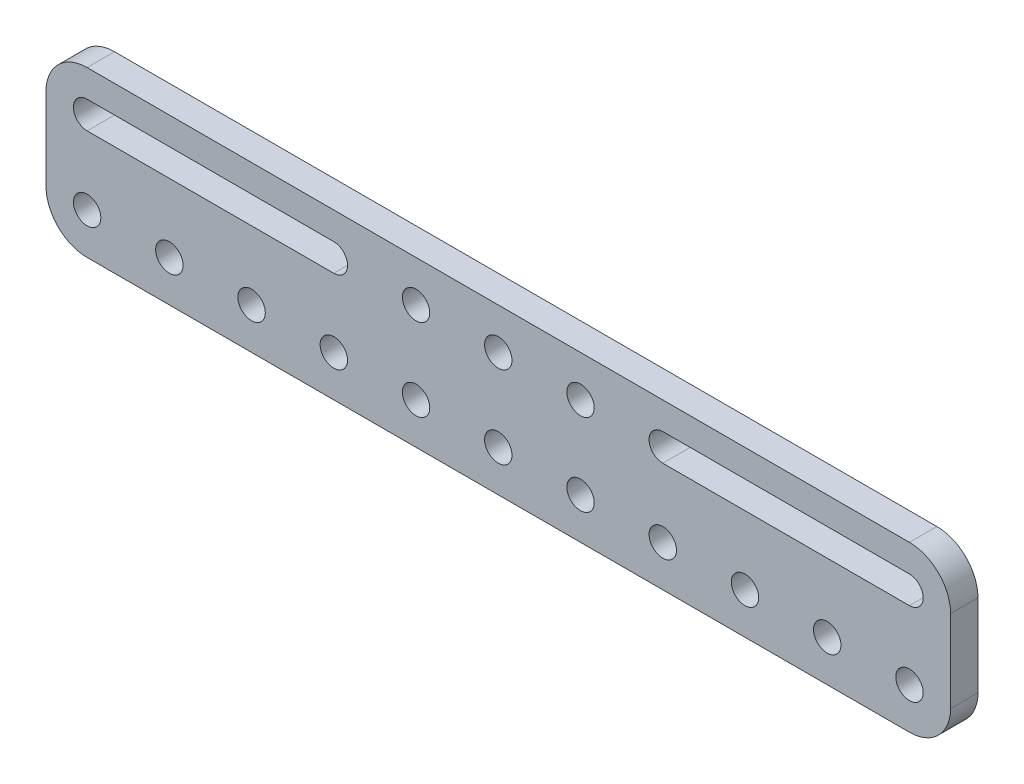
ISO-10303-21;
HEADER;
FILE_DESCRIPTION(('STEP AP214'),'2;1');
FILE_NAME('part.step','',(''),(''),'','','');
FILE_SCHEMA(('AUTOMOTIVE_DESIGN { 1 0 10303 214 1 1 1 1 }'));
ENDSEC;
DATA;
#1=APPLICATION_CONTEXT('core data for automotive mechanical design processes');
#2=APPLICATION_PROTOCOL_DEFINITION('international standard','automotive_design',2000,#1);
#3=PRODUCT_CONTEXT('',#1,'mechanical');
#4=PRODUCT('Part','Part','',(#3));
#5=PRODUCT_RELATED_PRODUCT_CATEGORY('part','',(#4));
#6=PRODUCT_DEFINITION_FORMATION('','',#4);
#7=PRODUCT_DEFINITION_CONTEXT('part definition',#1,'design');
#8=PRODUCT_DEFINITION('design','',#6,#7);
#9=PRODUCT_DEFINITION_SHAPE('','',#8);
#10=(LENGTH_UNIT() NAMED_UNIT(*) SI_UNIT(.MILLI.,.METRE.));
#11=(NAMED_UNIT(*) PLANE_ANGLE_UNIT() SI_UNIT($,.RADIAN.));
#12=(NAMED_UNIT(*) SI_UNIT($,.STERADIAN.) SOLID_ANGLE_UNIT());
#13=UNCERTAINTY_MEASURE_WITH_UNIT(LENGTH_MEASURE(1.E-05),#10,'distance_accuracy_value','');
#14=(GEOMETRIC_REPRESENTATION_CONTEXT(3) GLOBAL_UNCERTAINTY_ASSIGNED_CONTEXT((#13)) GLOBAL_UNIT_ASSIGNED_CONTEXT((#10,
#11,#12)) REPRESENTATION_CONTEXT('',''));
#15=CARTESIAN_POINT('',(0.,0.,0.));
#16=DIRECTION('',(0.,0.,1.));
#17=DIRECTION('',(1.,0.,0.));
#18=AXIS2_PLACEMENT_3D('',#15,#16,#17);
#19=CARTESIAN_POINT('',(346.4291313108,224.2422436139,3.));
#20=DIRECTION('',(0.,0.,1.));
#21=DIRECTION('',(1.,0.,0.));
#22=AXIS2_PLACEMENT_3D('',#19,#20,#21);
#23=PLANE('',#22);
#24=DIRECTION('',(1.,0.,0.));
#25=VECTOR('',#24,1.);
#26=CARTESIAN_POINT('',(256.4291313108,222.7422436139,3.));
#27=LINE('',#26,#25);
#28=CARTESIAN_POINT('',(256.4291313108,222.7422436139,3.));
#29=VERTEX_POINT('',#28);
#30=CARTESIAN_POINT('',(283.4291313108,222.7422436139,3.));
#31=VERTEX_POINT('',#30);
#32=EDGE_CURVE('E184',#29,#31,#27,.T.);
#33=ORIENTED_EDGE('',*,*,#32,.F.);
#34=CARTESIAN_POINT('',(256.4291313108,224.2422436139,3.));
#35=DIRECTION('',(0.,0.,1.));
#36=DIRECTION('',(1.,0.,0.));
#37=AXIS2_PLACEMENT_3D('',#34,#35,#36);
#38=CIRCLE('',#37,1.5);
#39=CARTESIAN_POINT('',(256.4291313108,225.7422436139,3.));
#40=VERTEX_POINT('',#39);
#41=EDGE_CURVE('E182',#40,#29,#38,.T.);
#42=ORIENTED_EDGE('',*,*,#41,.F.);
#43=DIRECTION('',(-1.,0.,0.));
#44=VECTOR('',#43,1.);
#45=CARTESIAN_POINT('',(256.4291313108,225.7422436139,3.));
#46=LINE('',#45,#44);
#47=CARTESIAN_POINT('',(283.4291313108,225.7422436139,3.));
#48=VERTEX_POINT('',#47);
#49=EDGE_CURVE('E190',#48,#40,#46,.T.);
#50=ORIENTED_EDGE('',*,*,#49,.F.);
#51=CARTESIAN_POINT('',(283.4291313108,224.2422436139,3.));
#52=DIRECTION('',(0.,0.,1.));
#53=DIRECTION('',(1.,0.,0.));
#54=AXIS2_PLACEMENT_3D('',#51,#52,#53);
#55=CIRCLE('',#54,1.5);
#56=EDGE_CURVE('E187',#31,#48,#55,.T.);
#57=ORIENTED_EDGE('',*,*,#56,.F.);
#58=EDGE_LOOP('',(#33,#42,#50,#57));
#59=FACE_BOUND('',#58,.T.);
#60=CARTESIAN_POINT('',(256.4291313108,215.2422436139,3.));
#61=DIRECTION('',(0.,0.,1.));
#62=DIRECTION('',(1.,0.,0.));
#63=AXIS2_PLACEMENT_3D('',#60,#61,#62);
#64=CIRCLE('',#63,1.49999999999983);
#65=CARTESIAN_POINT('',(257.9291313108,215.2422436139,3.));
#66=VERTEX_POINT('',#65);
#67=EDGE_CURVE('E219',#66,#66,#64,.T.);
#68=ORIENTED_EDGE('',*,*,#67,.F.);
#69=EDGE_LOOP('',(#68));
#70=FACE_BOUND('',#69,.T.);
#71=CARTESIAN_POINT('',(283.4291313108,215.2422436139,3.));
#72=DIRECTION('',(0.,0.,1.));
#73=DIRECTION('',(1.,0.,0.));
#74=AXIS2_PLACEMENT_3D('',#71,#72,#73);
#75=CIRCLE('',#74,1.5);
#76=CARTESIAN_POINT('',(284.9291313108,215.2422436139,3.));
#77=VERTEX_POINT('',#76);
#78=EDGE_CURVE('E231',#77,#77,#75,.T.);
#79=ORIENTED_EDGE('',*,*,#78,.F.);
#80=EDGE_LOOP('',(#79));
#81=FACE_BOUND('',#80,.T.);
#82=CARTESIAN_POINT('',(301.4291313108,215.2422436139,3.));
#83=DIRECTION('',(0.,0.,1.));
#84=DIRECTION('',(1.,0.,0.));
#85=AXIS2_PLACEMENT_3D('',#82,#83,#84);
#86=CIRCLE('',#85,1.5);
#87=CARTESIAN_POINT('',(302.9291313108,215.2422436139,3.));
#88=VERTEX_POINT('',#87);
#89=EDGE_CURVE('E243',#88,#88,#86,.T.);
#90=ORIENTED_EDGE('',*,*,#89,.F.);
#91=EDGE_LOOP('',(#90));
#92=FACE_BOUND('',#91,.T.);
#93=CARTESIAN_POINT('',(310.4291313108,215.2422436139,3.));
#94=DIRECTION('',(0.,0.,1.));
#95=DIRECTION('',(1.,0.,0.));
#96=AXIS2_PLACEMENT_3D('',#93,#94,#95);
#97=CIRCLE('',#96,1.5);
#98=CARTESIAN_POINT('',(311.9291313108,215.2422436139,3.));
#99=VERTEX_POINT('',#98);
#100=EDGE_CURVE('E255',#99,#99,#97,.T.);
#101=ORIENTED_EDGE('',*,*,#100,.F.);
#102=EDGE_LOOP('',(#101));
#103=FACE_BOUND('',#102,.T.);
#104=CARTESIAN_POINT('',(319.4291313108,215.2422436139,3.));
#105=DIRECTION('',(0.,0.,1.));
#106=DIRECTION('',(1.,0.,0.));
#107=AXIS2_PLACEMENT_3D('',#104,#105,#106);
#108=CIRCLE('',#107,1.5);
#109=CARTESIAN_POINT('',(320.9291313108,215.2422436139,3.));
#110=VERTEX_POINT('',#109);
#111=EDGE_CURVE('E267',#110,#110,#108,.T.);
#112=ORIENTED_EDGE('',*,*,#111,.F.);
#113=EDGE_LOOP('',(#112));
#114=FACE_BOUND('',#113,.T.);
#115=CARTESIAN_POINT('',(301.4291313108,224.2422436139,3.));
#116=DIRECTION('',(0.,0.,1.));
#117=DIRECTION('',(1.,0.,0.));
#118=AXIS2_PLACEMENT_3D('',#115,#116,#117);
#119=CIRCLE('',#118,1.5);
#120=CARTESIAN_POINT('',(302.9291313108,224.2422436139,3.));
#121=VERTEX_POINT('',#120);
#122=EDGE_CURVE('E279',#121,#121,#119,.T.);
#123=ORIENTED_EDGE('',*,*,#122,.F.);
#124=EDGE_LOOP('',(#123));
#125=FACE_BOUND('',#124,.T.);
#126=CARTESIAN_POINT('',(310.4291313108,224.2422436139,3.));
#127=DIRECTION('',(0.,0.,1.));
#128=DIRECTION('',(1.,0.,0.));
#129=AXIS2_PLACEMENT_3D('',#126,#127,#128);
#130=CIRCLE('',#129,1.5);
#131=CARTESIAN_POINT('',(311.9291313108,224.2422436139,3.));
#132=VERTEX_POINT('',#131);
#133=EDGE_CURVE('E291',#132,#132,#130,.T.);
#134=ORIENTED_EDGE('',*,*,#133,.F.);
#135=EDGE_LOOP('',(#134));
#136=FACE_BOUND('',#135,.T.);
#137=CARTESIAN_POINT('',(346.4291313108,224.2422436139,3.));
#138=DIRECTION('',(0.,0.,1.));
#139=DIRECTION('',(1.,0.,0.));
#140=AXIS2_PLACEMENT_3D('',#137,#138,#139);
#141=CIRCLE('',#140,4.5);
#142=CARTESIAN_POINT('',(350.9291313108,224.2422436139,3.));
#143=VERTEX_POINT('',#142);
#144=CARTESIAN_POINT('',(346.4291313108,228.7422436139,3.));
#145=VERTEX_POINT('',#144);
#146=EDGE_CURVE('E297',#143,#145,#141,.T.);
#147=ORIENTED_EDGE('',*,*,#146,.T.);
#148=DIRECTION('',(-1.,0.,0.));
#149=VECTOR('',#148,1.);
#150=CARTESIAN_POINT('',(256.4291313108,228.7422436139,3.));
#151=LINE('',#150,#149);
#152=CARTESIAN_POINT('',(256.4291313108,228.7422436139,3.));
#153=VERTEX_POINT('',#152);
#154=EDGE_CURVE('E300',#145,#153,#151,.T.);
#155=ORIENTED_EDGE('',*,*,#154,.T.);
#156=CARTESIAN_POINT('',(256.4291313108,224.2422436139,3.));
#157=DIRECTION('',(0.,0.,1.));
#158=DIRECTION('',(1.,0.,0.));
#159=AXIS2_PLACEMENT_3D('',#156,#157,#158);
#160=CIRCLE('',#159,4.5);
#161=CARTESIAN_POINT('',(251.9291313108,224.2422436139,3.));
#162=VERTEX_POINT('',#161);
#163=EDGE_CURVE('E303',#153,#162,#160,.T.);
#164=ORIENTED_EDGE('',*,*,#163,.T.);
#165=DIRECTION('',(0.,-1.,0.));
#166=VECTOR('',#165,1.);
#167=CARTESIAN_POINT('',(251.9291313108,224.2422436139,3.));
#168=LINE('',#167,#166);
#169=CARTESIAN_POINT('',(251.9291313108,215.2422436139,3.));
#170=VERTEX_POINT('',#169);
#171=EDGE_CURVE('E305',#162,#170,#168,.T.);
#172=ORIENTED_EDGE('',*,*,#171,.T.);
#173=CARTESIAN_POINT('',(256.4291313108,215.2422436139,3.));
#174=DIRECTION('',(0.,0.,1.));
#175=DIRECTION('',(1.,0.,0.));
#176=AXIS2_PLACEMENT_3D('',#173,#174,#175);
#177=CIRCLE('',#176,4.50000000000023);
#178=CARTESIAN_POINT('',(256.4291313108,210.7422436139,3.));
#179=VERTEX_POINT('',#178);
#180=EDGE_CURVE('E307',#170,#179,#177,.T.);
#181=ORIENTED_EDGE('',*,*,#180,.T.);
#182=DIRECTION('',(1.,0.,0.));
#183=VECTOR('',#182,1.);
#184=CARTESIAN_POINT('',(346.4291313108,210.7422436139,3.));
#185=LINE('',#184,#183);
#186=CARTESIAN_POINT('',(346.4291313108,210.7422436139,3.));
#187=VERTEX_POINT('',#186);
#188=EDGE_CURVE('E309',#179,#187,#185,.T.);
#189=ORIENTED_EDGE('',*,*,#188,.T.);
#190=CARTESIAN_POINT('',(346.4291313108,215.2422436139,3.));
#191=DIRECTION('',(0.,0.,1.));
#192=DIRECTION('',(1.,0.,0.));
#193=AXIS2_PLACEMENT_3D('',#190,#191,#192);
#194=CIRCLE('',#193,4.5);
#195=CARTESIAN_POINT('',(350.9291313108,215.2422436139,3.));
#196=VERTEX_POINT('',#195);
#197=EDGE_CURVE('E311',#187,#196,#194,.T.);
#198=ORIENTED_EDGE('',*,*,#197,.T.);
#199=DIRECTION('',(0.,1.,0.));
#200=VECTOR('',#199,1.);
#201=CARTESIAN_POINT('',(350.9291313108,224.2422436139,3.));
#202=LINE('',#201,#200);
#203=EDGE_CURVE('E313',#196,#143,#202,.T.);
#204=ORIENTED_EDGE('',*,*,#203,.T.);
#205=EDGE_LOOP('',(#147,#155,#164,#172,#181,#189,#198,#204));
#206=FACE_BOUND('',#205,.T.);
#207=CARTESIAN_POINT('',(292.4291313108,224.2422436139,3.));
#208=DIRECTION('',(0.,0.,1.));
#209=DIRECTION('',(1.,0.,0.));
#210=AXIS2_PLACEMENT_3D('',#207,#208,#209);
#211=CIRCLE('',#210,1.5);
#212=CARTESIAN_POINT('',(293.9291313108,224.2422436139,3.));
#213=VERTEX_POINT('',#212);
#214=EDGE_CURVE('E285',#213,#213,#211,.T.);
#215=ORIENTED_EDGE('',*,*,#214,.F.);
#216=EDGE_LOOP('',(#215));
#217=FACE_BOUND('',#216,.T.);
#218=CARTESIAN_POINT('',(337.4291313108,215.2422436139,3.));
#219=DIRECTION('',(0.,0.,1.));
#220=DIRECTION('',(1.,0.,0.));
#221=AXIS2_PLACEMENT_3D('',#218,#219,#220);
#222=CIRCLE('',#221,1.5);
#223=CARTESIAN_POINT('',(338.9291313108,215.2422436139,3.));
#224=VERTEX_POINT('',#223);
#225=EDGE_CURVE('E273',#224,#224,#222,.T.);
#226=ORIENTED_EDGE('',*,*,#225,.F.);
#227=EDGE_LOOP('',(#226));
#228=FACE_BOUND('',#227,.T.);
#229=CARTESIAN_POINT('',(328.4291313108,215.2422436139,3.));
#230=DIRECTION('',(0.,0.,1.));
#231=DIRECTION('',(1.,0.,0.));
#232=AXIS2_PLACEMENT_3D('',#229,#230,#231);
#233=CIRCLE('',#232,1.5);
#234=CARTESIAN_POINT('',(329.9291313108,215.2422436139,3.));
#235=VERTEX_POINT('',#234);
#236=EDGE_CURVE('E261',#235,#235,#233,.T.);
#237=ORIENTED_EDGE('',*,*,#236,.F.);
#238=EDGE_LOOP('',(#237));
#239=FACE_BOUND('',#238,.T.);
#240=CARTESIAN_POINT('',(292.4291313108,215.2422436139,3.));
#241=DIRECTION('',(0.,0.,1.));
#242=DIRECTION('',(1.,0.,0.));
#243=AXIS2_PLACEMENT_3D('',#240,#241,#242);
#244=CIRCLE('',#243,1.5);
#245=CARTESIAN_POINT('',(293.9291313108,215.2422436139,3.));
#246=VERTEX_POINT('',#245);
#247=EDGE_CURVE('E249',#246,#246,#244,.T.);
#248=ORIENTED_EDGE('',*,*,#247,.F.);
#249=EDGE_LOOP('',(#248));
#250=FACE_BOUND('',#249,.T.);
#251=CARTESIAN_POINT('',(274.4291313108,215.2422436139,3.));
#252=DIRECTION('',(0.,0.,1.));
#253=DIRECTION('',(1.,0.,0.));
#254=AXIS2_PLACEMENT_3D('',#251,#252,#253);
#255=CIRCLE('',#254,1.5);
#256=CARTESIAN_POINT('',(275.9291313108,215.2422436139,3.));
#257=VERTEX_POINT('',#256);
#258=EDGE_CURVE('E237',#257,#257,#255,.T.);
#259=ORIENTED_EDGE('',*,*,#258,.F.);
#260=EDGE_LOOP('',(#259));
#261=FACE_BOUND('',#260,.T.);
#262=CARTESIAN_POINT('',(265.4291313108,215.2422436139,3.));
#263=DIRECTION('',(0.,0.,1.));
#264=DIRECTION('',(1.,0.,0.));
#265=AXIS2_PLACEMENT_3D('',#262,#263,#264);
#266=CIRCLE('',#265,1.5);
#267=CARTESIAN_POINT('',(266.9291313108,215.2422436139,3.));
#268=VERTEX_POINT('',#267);
#269=EDGE_CURVE('E225',#268,#268,#266,.T.);
#270=ORIENTED_EDGE('',*,*,#269,.F.);
#271=EDGE_LOOP('',(#270));
#272=FACE_BOUND('',#271,.T.);
#273=CARTESIAN_POINT('',(346.4291313108,215.2422436139,3.));
#274=DIRECTION('',(0.,0.,1.));
#275=DIRECTION('',(1.,0.,0.));
#276=AXIS2_PLACEMENT_3D('',#273,#274,#275);
#277=CIRCLE('',#276,1.5);
#278=CARTESIAN_POINT('',(347.9291313108,215.2422436139,3.));
#279=VERTEX_POINT('',#278);
#280=EDGE_CURVE('E213',#279,#279,#277,.T.);
#281=ORIENTED_EDGE('',*,*,#280,.F.);
#282=EDGE_LOOP('',(#281));
#283=FACE_BOUND('',#282,.T.);
#284=DIRECTION('',(-1.,0.,0.));
#285=VECTOR('',#284,1.);
#286=CARTESIAN_POINT('',(319.4291313108,225.7422436139,3.));
#287=LINE('',#286,#285);
#288=CARTESIAN_POINT('',(346.4291313108,225.7422436139,3.));
#289=VERTEX_POINT('',#288);
#290=CARTESIAN_POINT('',(319.4291313108,225.7422436139,3.));
#291=VERTEX_POINT('',#290);
#292=EDGE_CURVE('E154',#289,#291,#287,.T.);
#293=ORIENTED_EDGE('',*,*,#292,.F.);
#294=CARTESIAN_POINT('',(346.4291313108,224.2422436139,3.));
#295=DIRECTION('',(0.,0.,1.));
#296=DIRECTION('',(1.,0.,0.));
#297=AXIS2_PLACEMENT_3D('',#294,#295,#296);
#298=CIRCLE('',#297,1.5);
#299=CARTESIAN_POINT('',(346.4291313108,222.7422436139,3.));
#300=VERTEX_POINT('',#299);
#301=EDGE_CURVE('E146',#300,#289,#298,.T.);
#302=ORIENTED_EDGE('',*,*,#301,.F.);
#303=DIRECTION('',(1.,0.,0.));
#304=VECTOR('',#303,1.);
#305=CARTESIAN_POINT('',(346.4291313108,222.7422436139,3.));
#306=LINE('',#305,#304);
#307=CARTESIAN_POINT('',(319.4291313108,222.7422436139,3.));
#308=VERTEX_POINT('',#307);
#309=EDGE_CURVE('E168',#308,#300,#306,.T.);
#310=ORIENTED_EDGE('',*,*,#309,.F.);
#311=CARTESIAN_POINT('',(319.4291313108,224.2422436139,3.));
#312=DIRECTION('',(0.,0.,1.));
#313=DIRECTION('',(1.,0.,0.));
#314=AXIS2_PLACEMENT_3D('',#311,#312,#313);
#315=CIRCLE('',#314,1.5);
#316=EDGE_CURVE('E166',#291,#308,#315,.T.);
#317=ORIENTED_EDGE('',*,*,#316,.F.);
#318=EDGE_LOOP('',(#293,#302,#310,#317));
#319=FACE_BOUND('',#318,.T.);
#320=ADVANCED_FACE('F33',(#59,#70,#81,#92,#103,#114,#125,#136,#206,#217,#228,#239,#250,#261,
#272,#283,#319),#23,.T.);
#321=CARTESIAN_POINT('',(346.4291313108,224.2422436139,0.));
#322=DIRECTION('',(0.,0.,1.));
#323=DIRECTION('',(1.,0.,0.));
#324=AXIS2_PLACEMENT_3D('',#321,#322,#323);
#325=PLANE('',#324);
#326=CARTESIAN_POINT('',(256.4291313108,224.2422436139,0.));
#327=DIRECTION('',(0.,0.,1.));
#328=DIRECTION('',(1.,0.,0.));
#329=AXIS2_PLACEMENT_3D('',#326,#327,#328);
#330=CIRCLE('',#329,1.5);
#331=CARTESIAN_POINT('',(256.4291313108,225.7422436139,0.));
#332=VERTEX_POINT('',#331);
#333=CARTESIAN_POINT('',(256.4291313108,222.7422436139,0.));
#334=VERTEX_POINT('',#333);
#335=EDGE_CURVE('E162',#332,#334,#330,.T.);
#336=ORIENTED_EDGE('',*,*,#335,.T.);
#337=DIRECTION('',(1.,0.,0.));
#338=VECTOR('',#337,1.);
#339=CARTESIAN_POINT('',(256.4291313108,222.7422436139,0.));
#340=LINE('',#339,#338);
#341=CARTESIAN_POINT('',(283.4291313108,222.7422436139,0.));
#342=VERTEX_POINT('',#341);
#343=EDGE_CURVE('E195',#334,#342,#340,.T.);
#344=ORIENTED_EDGE('',*,*,#343,.T.);
#345=CARTESIAN_POINT('',(283.4291313108,224.2422436139,0.));
#346=DIRECTION('',(0.,0.,1.));
#347=DIRECTION('',(1.,0.,0.));
#348=AXIS2_PLACEMENT_3D('',#345,#346,#347);
#349=CIRCLE('',#348,1.5);
#350=CARTESIAN_POINT('',(283.4291313108,225.7422436139,0.));
#351=VERTEX_POINT('',#350);
#352=EDGE_CURVE('E198',#342,#351,#349,.T.);
#353=ORIENTED_EDGE('',*,*,#352,.T.);
#354=DIRECTION('',(-1.,0.,0.));
#355=VECTOR('',#354,1.);
#356=CARTESIAN_POINT('',(256.4291313108,225.7422436139,0.));
#357=LINE('',#356,#355);
#358=EDGE_CURVE('E185',#351,#332,#357,.T.);
#359=ORIENTED_EDGE('',*,*,#358,.T.);
#360=EDGE_LOOP('',(#336,#344,#353,#359));
#361=FACE_BOUND('',#360,.T.);
#362=CARTESIAN_POINT('',(256.4291313108,215.2422436139,0.));
#363=DIRECTION('',(0.,0.,1.));
#364=DIRECTION('',(1.,0.,0.));
#365=AXIS2_PLACEMENT_3D('',#362,#363,#364);
#366=CIRCLE('',#365,1.49999999999983);
#367=CARTESIAN_POINT('',(257.9291313108,215.2422436139,0.));
#368=VERTEX_POINT('',#367);
#369=EDGE_CURVE('E216',#368,#368,#366,.T.);
#370=ORIENTED_EDGE('',*,*,#369,.T.);
#371=EDGE_LOOP('',(#370));
#372=FACE_BOUND('',#371,.T.);
#373=CARTESIAN_POINT('',(283.4291313108,215.2422436139,0.));
#374=DIRECTION('',(0.,0.,1.));
#375=DIRECTION('',(1.,0.,0.));
#376=AXIS2_PLACEMENT_3D('',#373,#374,#375);
#377=CIRCLE('',#376,1.5);
#378=CARTESIAN_POINT('',(284.9291313108,215.2422436139,0.));
#379=VERTEX_POINT('',#378);
#380=EDGE_CURVE('E228',#379,#379,#377,.T.);
#381=ORIENTED_EDGE('',*,*,#380,.T.);
#382=EDGE_LOOP('',(#381));
#383=FACE_BOUND('',#382,.T.);
#384=CARTESIAN_POINT('',(301.4291313108,215.2422436139,0.));
#385=DIRECTION('',(0.,0.,1.));
#386=DIRECTION('',(1.,0.,0.));
#387=AXIS2_PLACEMENT_3D('',#384,#385,#386);
#388=CIRCLE('',#387,1.5);
#389=CARTESIAN_POINT('',(302.9291313108,215.2422436139,0.));
#390=VERTEX_POINT('',#389);
#391=EDGE_CURVE('E240',#390,#390,#388,.T.);
#392=ORIENTED_EDGE('',*,*,#391,.T.);
#393=EDGE_LOOP('',(#392));
#394=FACE_BOUND('',#393,.T.);
#395=CARTESIAN_POINT('',(310.4291313108,215.2422436139,0.));
#396=DIRECTION('',(0.,0.,1.));
#397=DIRECTION('',(1.,0.,0.));
#398=AXIS2_PLACEMENT_3D('',#395,#396,#397);
#399=CIRCLE('',#398,1.5);
#400=CARTESIAN_POINT('',(311.9291313108,215.2422436139,0.));
#401=VERTEX_POINT('',#400);
#402=EDGE_CURVE('E252',#401,#401,#399,.T.);
#403=ORIENTED_EDGE('',*,*,#402,.T.);
#404=EDGE_LOOP('',(#403));
#405=FACE_BOUND('',#404,.T.);
#406=CARTESIAN_POINT('',(319.4291313108,215.2422436139,0.));
#407=DIRECTION('',(0.,0.,1.));
#408=DIRECTION('',(1.,0.,0.));
#409=AXIS2_PLACEMENT_3D('',#406,#407,#408);
#410=CIRCLE('',#409,1.5);
#411=CARTESIAN_POINT('',(320.9291313108,215.2422436139,0.));
#412=VERTEX_POINT('',#411);
#413=EDGE_CURVE('E264',#412,#412,#410,.T.);
#414=ORIENTED_EDGE('',*,*,#413,.T.);
#415=EDGE_LOOP('',(#414));
#416=FACE_BOUND('',#415,.T.);
#417=CARTESIAN_POINT('',(301.4291313108,224.2422436139,0.));
#418=DIRECTION('',(0.,0.,1.));
#419=DIRECTION('',(1.,0.,0.));
#420=AXIS2_PLACEMENT_3D('',#417,#418,#419);
#421=CIRCLE('',#420,1.5);
#422=CARTESIAN_POINT('',(302.9291313108,224.2422436139,0.));
#423=VERTEX_POINT('',#422);
#424=EDGE_CURVE('E276',#423,#423,#421,.T.);
#425=ORIENTED_EDGE('',*,*,#424,.T.);
#426=EDGE_LOOP('',(#425));
#427=FACE_BOUND('',#426,.T.);
#428=CARTESIAN_POINT('',(310.4291313108,224.2422436139,0.));
#429=DIRECTION('',(0.,0.,1.));
#430=DIRECTION('',(1.,0.,0.));
#431=AXIS2_PLACEMENT_3D('',#428,#429,#430);
#432=CIRCLE('',#431,1.5);
#433=CARTESIAN_POINT('',(311.9291313108,224.2422436139,0.));
#434=VERTEX_POINT('',#433);
#435=EDGE_CURVE('E288',#434,#434,#432,.T.);
#436=ORIENTED_EDGE('',*,*,#435,.T.);
#437=EDGE_LOOP('',(#436));
#438=FACE_BOUND('',#437,.T.);
#439=CARTESIAN_POINT('',(346.4291313108,224.2422436139,0.));
#440=DIRECTION('',(0.,0.,1.));
#441=DIRECTION('',(1.,0.,0.));
#442=AXIS2_PLACEMENT_3D('',#439,#440,#441);
#443=CIRCLE('',#442,4.5);
#444=CARTESIAN_POINT('',(350.9291313108,224.2422436139,0.));
#445=VERTEX_POINT('',#444);
#446=CARTESIAN_POINT('',(346.4291313108,228.7422436139,0.));
#447=VERTEX_POINT('',#446);
#448=EDGE_CURVE('E294',#445,#447,#443,.T.);
#449=ORIENTED_EDGE('',*,*,#448,.F.);
#450=DIRECTION('',(0.,1.,0.));
#451=VECTOR('',#450,1.);
#452=CARTESIAN_POINT('',(350.9291313108,224.2422436139,0.));
#453=LINE('',#452,#451);
#454=CARTESIAN_POINT('',(350.9291313108,215.2422436139,0.));
#455=VERTEX_POINT('',#454);
#456=EDGE_CURVE('E301',#455,#445,#453,.T.);
#457=ORIENTED_EDGE('',*,*,#456,.F.);
#458=CARTESIAN_POINT('',(346.4291313108,215.2422436139,0.));
#459=DIRECTION('',(0.,0.,1.));
#460=DIRECTION('',(1.,0.,0.));
#461=AXIS2_PLACEMENT_3D('',#458,#459,#460);
#462=CIRCLE('',#461,4.5);
#463=CARTESIAN_POINT('',(346.4291313108,210.7422436139,0.));
#464=VERTEX_POINT('',#463);
#465=EDGE_CURVE('E328',#464,#455,#462,.T.);
#466=ORIENTED_EDGE('',*,*,#465,.F.);
#467=DIRECTION('',(1.,0.,0.));
#468=VECTOR('',#467,1.);
#469=CARTESIAN_POINT('',(346.4291313108,210.7422436139,0.));
#470=LINE('',#469,#468);
#471=CARTESIAN_POINT('',(256.4291313108,210.7422436139,0.));
#472=VERTEX_POINT('',#471);
#473=EDGE_CURVE('E326',#472,#464,#470,.T.);
#474=ORIENTED_EDGE('',*,*,#473,.F.);
#475=CARTESIAN_POINT('',(256.4291313108,215.2422436139,0.));
#476=DIRECTION('',(0.,0.,1.));
#477=DIRECTION('',(1.,0.,0.));
#478=AXIS2_PLACEMENT_3D('',#475,#476,#477);
#479=CIRCLE('',#478,4.50000000000023);
#480=CARTESIAN_POINT('',(251.9291313108,215.2422436139,0.));
#481=VERTEX_POINT('',#480);
#482=EDGE_CURVE('E324',#481,#472,#479,.T.);
#483=ORIENTED_EDGE('',*,*,#482,.F.);
#484=DIRECTION('',(0.,-1.,0.));
#485=VECTOR('',#484,1.);
#486=CARTESIAN_POINT('',(251.9291313108,224.2422436139,0.));
#487=LINE('',#486,#485);
#488=CARTESIAN_POINT('',(251.9291313108,224.2422436139,0.));
#489=VERTEX_POINT('',#488);
#490=EDGE_CURVE('E322',#489,#481,#487,.T.);
#491=ORIENTED_EDGE('',*,*,#490,.F.);
#492=CARTESIAN_POINT('',(256.4291313108,224.2422436139,0.));
#493=DIRECTION('',(0.,0.,1.));
#494=DIRECTION('',(1.,0.,0.));
#495=AXIS2_PLACEMENT_3D('',#492,#493,#494);
#496=CIRCLE('',#495,4.5);
#497=CARTESIAN_POINT('',(256.4291313108,228.7422436139,0.));
#498=VERTEX_POINT('',#497);
#499=EDGE_CURVE('E320',#498,#489,#496,.T.);
#500=ORIENTED_EDGE('',*,*,#499,.F.);
#501=DIRECTION('',(-1.,0.,0.));
#502=VECTOR('',#501,1.);
#503=CARTESIAN_POINT('',(256.4291313108,228.7422436139,0.));
#504=LINE('',#503,#502);
#505=EDGE_CURVE('E318',#447,#498,#504,.T.);
#506=ORIENTED_EDGE('',*,*,#505,.F.);
#507=EDGE_LOOP('',(#449,#457,#466,#474,#483,#491,#500,#506));
#508=FACE_BOUND('',#507,.T.);
#509=CARTESIAN_POINT('',(292.4291313108,224.2422436139,0.));
#510=DIRECTION('',(0.,0.,1.));
#511=DIRECTION('',(1.,0.,0.));
#512=AXIS2_PLACEMENT_3D('',#509,#510,#511);
#513=CIRCLE('',#512,1.5);
#514=CARTESIAN_POINT('',(293.9291313108,224.2422436139,0.));
#515=VERTEX_POINT('',#514);
#516=EDGE_CURVE('E282',#515,#515,#513,.T.);
#517=ORIENTED_EDGE('',*,*,#516,.T.);
#518=EDGE_LOOP('',(#517));
#519=FACE_BOUND('',#518,.T.);
#520=CARTESIAN_POINT('',(337.4291313108,215.2422436139,0.));
#521=DIRECTION('',(0.,0.,1.));
#522=DIRECTION('',(1.,0.,0.));
#523=AXIS2_PLACEMENT_3D('',#520,#521,#522);
#524=CIRCLE('',#523,1.5);
#525=CARTESIAN_POINT('',(338.9291313108,215.2422436139,0.));
#526=VERTEX_POINT('',#525);
#527=EDGE_CURVE('E270',#526,#526,#524,.T.);
#528=ORIENTED_EDGE('',*,*,#527,.T.);
#529=EDGE_LOOP('',(#528));
#530=FACE_BOUND('',#529,.T.);
#531=CARTESIAN_POINT('',(328.4291313108,215.2422436139,0.));
#532=DIRECTION('',(0.,0.,1.));
#533=DIRECTION('',(1.,0.,0.));
#534=AXIS2_PLACEMENT_3D('',#531,#532,#533);
#535=CIRCLE('',#534,1.5);
#536=CARTESIAN_POINT('',(329.9291313108,215.2422436139,0.));
#537=VERTEX_POINT('',#536);
#538=EDGE_CURVE('E258',#537,#537,#535,.T.);
#539=ORIENTED_EDGE('',*,*,#538,.T.);
#540=EDGE_LOOP('',(#539));
#541=FACE_BOUND('',#540,.T.);
#542=CARTESIAN_POINT('',(292.4291313108,215.2422436139,0.));
#543=DIRECTION('',(0.,0.,1.));
#544=DIRECTION('',(1.,0.,0.));
#545=AXIS2_PLACEMENT_3D('',#542,#543,#544);
#546=CIRCLE('',#545,1.5);
#547=CARTESIAN_POINT('',(293.9291313108,215.2422436139,0.));
#548=VERTEX_POINT('',#547);
#549=EDGE_CURVE('E246',#548,#548,#546,.T.);
#550=ORIENTED_EDGE('',*,*,#549,.T.);
#551=EDGE_LOOP('',(#550));
#552=FACE_BOUND('',#551,.T.);
#553=CARTESIAN_POINT('',(274.4291313108,215.2422436139,0.));
#554=DIRECTION('',(0.,0.,1.));
#555=DIRECTION('',(1.,0.,0.));
#556=AXIS2_PLACEMENT_3D('',#553,#554,#555);
#557=CIRCLE('',#556,1.5);
#558=CARTESIAN_POINT('',(275.9291313108,215.2422436139,0.));
#559=VERTEX_POINT('',#558);
#560=EDGE_CURVE('E234',#559,#559,#557,.T.);
#561=ORIENTED_EDGE('',*,*,#560,.T.);
#562=EDGE_LOOP('',(#561));
#563=FACE_BOUND('',#562,.T.);
#564=CARTESIAN_POINT('',(265.4291313108,215.2422436139,0.));
#565=DIRECTION('',(0.,0.,1.));
#566=DIRECTION('',(1.,0.,0.));
#567=AXIS2_PLACEMENT_3D('',#564,#565,#566);
#568=CIRCLE('',#567,1.5);
#569=CARTESIAN_POINT('',(266.9291313108,215.2422436139,0.));
#570=VERTEX_POINT('',#569);
#571=EDGE_CURVE('E222',#570,#570,#568,.T.);
#572=ORIENTED_EDGE('',*,*,#571,.T.);
#573=EDGE_LOOP('',(#572));
#574=FACE_BOUND('',#573,.T.);
#575=CARTESIAN_POINT('',(346.4291313108,215.2422436139,0.));
#576=DIRECTION('',(0.,0.,1.));
#577=DIRECTION('',(1.,0.,0.));
#578=AXIS2_PLACEMENT_3D('',#575,#576,#577);
#579=CIRCLE('',#578,1.5);
#580=CARTESIAN_POINT('',(347.9291313108,215.2422436139,0.));
#581=VERTEX_POINT('',#580);
#582=EDGE_CURVE('E212',#581,#581,#579,.T.);
#583=ORIENTED_EDGE('',*,*,#582,.T.);
#584=EDGE_LOOP('',(#583));
#585=FACE_BOUND('',#584,.T.);
#586=CARTESIAN_POINT('',(346.4291313108,224.2422436139,0.));
#587=DIRECTION('',(0.,0.,1.));
#588=DIRECTION('',(1.,0.,0.));
#589=AXIS2_PLACEMENT_3D('',#586,#587,#588);
#590=CIRCLE('',#589,1.5);
#591=CARTESIAN_POINT('',(346.4291313108,222.7422436139,0.));
#592=VERTEX_POINT('',#591);
#593=CARTESIAN_POINT('',(346.4291313108,225.7422436139,0.));
#594=VERTEX_POINT('',#593);
#595=EDGE_CURVE('E56',#592,#594,#590,.T.);
#596=ORIENTED_EDGE('',*,*,#595,.T.);
#597=DIRECTION('',(-1.,0.,0.));
#598=VECTOR('',#597,1.);
#599=CARTESIAN_POINT('',(319.4291313108,225.7422436139,0.));
#600=LINE('',#599,#598);
#601=CARTESIAN_POINT('',(319.4291313108,225.7422436139,0.));
#602=VERTEX_POINT('',#601);
#603=EDGE_CURVE('E161',#594,#602,#600,.T.);
#604=ORIENTED_EDGE('',*,*,#603,.T.);
#605=CARTESIAN_POINT('',(319.4291313108,224.2422436139,0.));
#606=DIRECTION('',(0.,0.,1.));
#607=DIRECTION('',(1.,0.,0.));
#608=AXIS2_PLACEMENT_3D('',#605,#606,#607);
#609=CIRCLE('',#608,1.5);
#610=CARTESIAN_POINT('',(319.4291313108,222.7422436139,0.));
#611=VERTEX_POINT('',#610);
#612=EDGE_CURVE('E174',#602,#611,#609,.T.);
#613=ORIENTED_EDGE('',*,*,#612,.T.);
#614=DIRECTION('',(1.,0.,0.));
#615=VECTOR('',#614,1.);
#616=CARTESIAN_POINT('',(346.4291313108,222.7422436139,0.));
#617=LINE('',#616,#615);
#618=EDGE_CURVE('E155',#611,#592,#617,.T.);
#619=ORIENTED_EDGE('',*,*,#618,.T.);
#620=EDGE_LOOP('',(#596,#604,#613,#619));
#621=FACE_BOUND('',#620,.T.);
#622=ADVANCED_FACE('F358',(#361,#372,#383,#394,#405,#416,#427,#438,#508,#519,#530,#541,#552,
#563,#574,#585,#621),#325,.F.);
#623=CARTESIAN_POINT('',(346.4291313108,224.2422436139,3.));
#624=DIRECTION('',(0.,0.,-1.));
#625=DIRECTION('',(-1.,0.,0.));
#626=AXIS2_PLACEMENT_3D('',#623,#624,#625);
#627=CYLINDRICAL_SURFACE('',#626,4.5);
#628=ORIENTED_EDGE('',*,*,#448,.T.);
#629=DIRECTION('',(0.,0.,-1.));
#630=VECTOR('',#629,1.);
#631=CARTESIAN_POINT('',(346.4291313108,228.7422436139,3.));
#632=LINE('',#631,#630);
#633=EDGE_CURVE('E11',#145,#447,#632,.T.);
#634=ORIENTED_EDGE('',*,*,#633,.F.);
#635=ORIENTED_EDGE('',*,*,#146,.F.);
#636=DIRECTION('',(0.,0.,-1.));
#637=VECTOR('',#636,1.);
#638=CARTESIAN_POINT('',(350.9291313108,224.2422436139,3.));
#639=LINE('',#638,#637);
#640=EDGE_CURVE('E315',#143,#445,#639,.T.);
#641=ORIENTED_EDGE('',*,*,#640,.T.);
#642=EDGE_LOOP('',(#628,#634,#635,#641));
#643=FACE_BOUND('',#642,.T.);
#644=ADVANCED_FACE('F35',(#643),#627,.T.);
#645=CARTESIAN_POINT('',(256.4291313108,228.7422436139,3.));
#646=DIRECTION('',(0.,-1.,0.));
#647=DIRECTION('',(0.,0.,-1.));
#648=AXIS2_PLACEMENT_3D('',#645,#646,#647);
#649=PLANE('',#648);
#650=ORIENTED_EDGE('',*,*,#505,.T.);
#651=DIRECTION('',(0.,0.,-1.));
#652=VECTOR('',#651,1.);
#653=CARTESIAN_POINT('',(256.4291313108,228.7422436139,3.));
#654=LINE('',#653,#652);
#655=EDGE_CURVE('E41',#153,#498,#654,.T.);
#656=ORIENTED_EDGE('',*,*,#655,.F.);
#657=ORIENTED_EDGE('',*,*,#154,.F.);
#658=ORIENTED_EDGE('',*,*,#633,.T.);
#659=EDGE_LOOP('',(#650,#656,#657,#658));
#660=FACE_BOUND('',#659,.T.);
#661=ADVANCED_FACE('F376',(#660),#649,.F.);
#662=CARTESIAN_POINT('',(256.4291313108,224.2422436139,3.));
#663=DIRECTION('',(0.,0.,-1.));
#664=DIRECTION('',(-1.,0.,0.));
#665=AXIS2_PLACEMENT_3D('',#662,#663,#664);
#666=CYLINDRICAL_SURFACE('',#665,4.5);
#667=ORIENTED_EDGE('',*,*,#499,.T.);
#668=DIRECTION('',(0.,0.,-1.));
#669=VECTOR('',#668,1.);
#670=CARTESIAN_POINT('',(251.9291313108,224.2422436139,3.));
#671=LINE('',#670,#669);
#672=EDGE_CURVE('E345',#162,#489,#671,.T.);
#673=ORIENTED_EDGE('',*,*,#672,.F.);
#674=ORIENTED_EDGE('',*,*,#163,.F.);
#675=ORIENTED_EDGE('',*,*,#655,.T.);
#676=EDGE_LOOP('',(#667,#673,#674,#675));
#677=FACE_BOUND('',#676,.T.);
#678=ADVANCED_FACE('F352',(#677),#666,.T.);
#679=CARTESIAN_POINT('',(251.9291313108,224.2422436139,3.));
#680=DIRECTION('',(1.,0.,0.));
#681=DIRECTION('',(0.,0.,-1.));
#682=AXIS2_PLACEMENT_3D('',#679,#680,#681);
#683=PLANE('',#682);
#684=ORIENTED_EDGE('',*,*,#490,.T.);
#685=DIRECTION('',(0.,0.,-1.));
#686=VECTOR('',#685,1.);
#687=CARTESIAN_POINT('',(251.9291313108,215.2422436139,3.));
#688=LINE('',#687,#686);
#689=EDGE_CURVE('E342',#170,#481,#688,.T.);
#690=ORIENTED_EDGE('',*,*,#689,.F.);
#691=ORIENTED_EDGE('',*,*,#171,.F.);
#692=ORIENTED_EDGE('',*,*,#672,.T.);
#693=EDGE_LOOP('',(#684,#690,#691,#692));
#694=FACE_BOUND('',#693,.T.);
#695=ADVANCED_FACE('F364',(#694),#683,.F.);
#696=CARTESIAN_POINT('',(256.4291313108,215.2422436139,3.));
#697=DIRECTION('',(0.,0.,-1.));
#698=DIRECTION('',(-1.,0.,0.));
#699=AXIS2_PLACEMENT_3D('',#696,#697,#698);
#700=CYLINDRICAL_SURFACE('',#699,4.50000000000023);
#701=ORIENTED_EDGE('',*,*,#482,.T.);
#702=DIRECTION('',(0.,0.,-1.));
#703=VECTOR('',#702,1.);
#704=CARTESIAN_POINT('',(256.4291313108,210.7422436139,3.));
#705=LINE('',#704,#703);
#706=EDGE_CURVE('E339',#179,#472,#705,.T.);
#707=ORIENTED_EDGE('',*,*,#706,.F.);
#708=ORIENTED_EDGE('',*,*,#180,.F.);
#709=ORIENTED_EDGE('',*,*,#689,.T.);
#710=EDGE_LOOP('',(#701,#707,#708,#709));
#711=FACE_BOUND('',#710,.T.);
#712=ADVANCED_FACE('F368',(#711),#700,.T.);
#713=CARTESIAN_POINT('',(346.4291313108,210.7422436139,3.));
#714=DIRECTION('',(0.,1.,0.));
#715=DIRECTION('',(0.,0.,1.));
#716=AXIS2_PLACEMENT_3D('',#713,#714,#715);
#717=PLANE('',#716);
#718=ORIENTED_EDGE('',*,*,#473,.T.);
#719=DIRECTION('',(0.,0.,-1.));
#720=VECTOR('',#719,1.);
#721=CARTESIAN_POINT('',(346.4291313108,210.7422436139,3.));
#722=LINE('',#721,#720);
#723=EDGE_CURVE('E336',#187,#464,#722,.T.);
#724=ORIENTED_EDGE('',*,*,#723,.F.);
#725=ORIENTED_EDGE('',*,*,#188,.F.);
#726=ORIENTED_EDGE('',*,*,#706,.T.);
#727=EDGE_LOOP('',(#718,#724,#725,#726));
#728=FACE_BOUND('',#727,.T.);
#729=ADVANCED_FACE('F389',(#728),#717,.F.);
#730=CARTESIAN_POINT('',(346.4291313108,215.2422436139,3.));
#731=DIRECTION('',(0.,0.,-1.));
#732=DIRECTION('',(-1.,0.,0.));
#733=AXIS2_PLACEMENT_3D('',#730,#731,#732);
#734=CYLINDRICAL_SURFACE('',#733,4.5);
#735=ORIENTED_EDGE('',*,*,#465,.T.);
#736=DIRECTION('',(0.,0.,-1.));
#737=VECTOR('',#736,1.);
#738=CARTESIAN_POINT('',(350.9291313108,215.2422436139,3.));
#739=LINE('',#738,#737);
#740=EDGE_CURVE('E333',#196,#455,#739,.T.);
#741=ORIENTED_EDGE('',*,*,#740,.F.);
#742=ORIENTED_EDGE('',*,*,#197,.F.);
#743=ORIENTED_EDGE('',*,*,#723,.T.);
#744=EDGE_LOOP('',(#735,#741,#742,#743));
#745=FACE_BOUND('',#744,.T.);
#746=ADVANCED_FACE('F387',(#745),#734,.T.);
#747=CARTESIAN_POINT('',(350.9291313108,224.2422436139,3.));
#748=DIRECTION('',(-1.,0.,0.));
#749=DIRECTION('',(0.,0.,1.));
#750=AXIS2_PLACEMENT_3D('',#747,#748,#749);
#751=PLANE('',#750);
#752=ORIENTED_EDGE('',*,*,#456,.T.);
#753=ORIENTED_EDGE('',*,*,#640,.F.);
#754=ORIENTED_EDGE('',*,*,#203,.F.);
#755=ORIENTED_EDGE('',*,*,#740,.T.);
#756=EDGE_LOOP('',(#752,#753,#754,#755));
#757=FACE_BOUND('',#756,.T.);
#758=ADVANCED_FACE('F382',(#757),#751,.F.);
#759=CARTESIAN_POINT('',(310.4291313108,224.2422436139,3.));
#760=DIRECTION('',(0.,0.,-1.));
#761=DIRECTION('',(-1.,0.,0.));
#762=AXIS2_PLACEMENT_3D('',#759,#760,#761);
#763=CYLINDRICAL_SURFACE('',#762,1.5);
#764=ORIENTED_EDGE('',*,*,#133,.T.);
#765=EDGE_LOOP('',(#764));
#766=FACE_BOUND('',#765,.T.);
#767=ORIENTED_EDGE('',*,*,#435,.F.);
#768=EDGE_LOOP('',(#767));
#769=FACE_BOUND('',#768,.T.);
#770=ADVANCED_FACE('F409',(#766,#769),#763,.F.);
#771=CARTESIAN_POINT('',(292.4291313108,224.2422436139,3.));
#772=DIRECTION('',(0.,0.,-1.));
#773=DIRECTION('',(-1.,0.,0.));
#774=AXIS2_PLACEMENT_3D('',#771,#772,#773);
#775=CYLINDRICAL_SURFACE('',#774,1.5);
#776=ORIENTED_EDGE('',*,*,#214,.T.);
#777=EDGE_LOOP('',(#776));
#778=FACE_BOUND('',#777,.T.);
#779=ORIENTED_EDGE('',*,*,#516,.F.);
#780=EDGE_LOOP('',(#779));
#781=FACE_BOUND('',#780,.T.);
#782=ADVANCED_FACE('F416',(#778,#781),#775,.F.);
#783=CARTESIAN_POINT('',(301.4291313108,224.2422436139,3.));
#784=DIRECTION('',(0.,0.,-1.));
#785=DIRECTION('',(-1.,0.,0.));
#786=AXIS2_PLACEMENT_3D('',#783,#784,#785);
#787=CYLINDRICAL_SURFACE('',#786,1.5);
#788=ORIENTED_EDGE('',*,*,#122,.T.);
#789=EDGE_LOOP('',(#788));
#790=FACE_BOUND('',#789,.T.);
#791=ORIENTED_EDGE('',*,*,#424,.F.);
#792=EDGE_LOOP('',(#791));
#793=FACE_BOUND('',#792,.T.);
#794=ADVANCED_FACE('F421',(#790,#793),#787,.F.);
#795=CARTESIAN_POINT('',(337.4291313108,215.2422436139,3.));
#796=DIRECTION('',(0.,0.,-1.));
#797=DIRECTION('',(-1.,0.,0.));
#798=AXIS2_PLACEMENT_3D('',#795,#796,#797);
#799=CYLINDRICAL_SURFACE('',#798,1.5);
#800=ORIENTED_EDGE('',*,*,#225,.T.);
#801=EDGE_LOOP('',(#800));
#802=FACE_BOUND('',#801,.T.);
#803=ORIENTED_EDGE('',*,*,#527,.F.);
#804=EDGE_LOOP('',(#803));
#805=FACE_BOUND('',#804,.T.);
#806=ADVANCED_FACE('F431',(#802,#805),#799,.F.);
#807=CARTESIAN_POINT('',(319.4291313108,215.2422436139,3.));
#808=DIRECTION('',(0.,0.,-1.));
#809=DIRECTION('',(-1.,0.,0.));
#810=AXIS2_PLACEMENT_3D('',#807,#808,#809);
#811=CYLINDRICAL_SURFACE('',#810,1.5);
#812=ORIENTED_EDGE('',*,*,#111,.T.);
#813=EDGE_LOOP('',(#812));
#814=FACE_BOUND('',#813,.T.);
#815=ORIENTED_EDGE('',*,*,#413,.F.);
#816=EDGE_LOOP('',(#815));
#817=FACE_BOUND('',#816,.T.);
#818=ADVANCED_FACE('F438',(#814,#817),#811,.F.);
#819=CARTESIAN_POINT('',(328.4291313108,215.2422436139,3.));
#820=DIRECTION('',(0.,0.,-1.));
#821=DIRECTION('',(-1.,0.,0.));
#822=AXIS2_PLACEMENT_3D('',#819,#820,#821);
#823=CYLINDRICAL_SURFACE('',#822,1.5);
#824=ORIENTED_EDGE('',*,*,#236,.T.);
#825=EDGE_LOOP('',(#824));
#826=FACE_BOUND('',#825,.T.);
#827=ORIENTED_EDGE('',*,*,#538,.F.);
#828=EDGE_LOOP('',(#827));
#829=FACE_BOUND('',#828,.T.);
#830=ADVANCED_FACE('F442',(#826,#829),#823,.F.);
#831=CARTESIAN_POINT('',(310.4291313108,215.2422436139,3.));
#832=DIRECTION('',(0.,0.,-1.));
#833=DIRECTION('',(-1.,0.,0.));
#834=AXIS2_PLACEMENT_3D('',#831,#832,#833);
#835=CYLINDRICAL_SURFACE('',#834,1.5);
#836=ORIENTED_EDGE('',*,*,#100,.T.);
#837=EDGE_LOOP('',(#836));
#838=FACE_BOUND('',#837,.T.);
#839=ORIENTED_EDGE('',*,*,#402,.F.);
#840=EDGE_LOOP('',(#839));
#841=FACE_BOUND('',#840,.T.);
#842=ADVANCED_FACE('F446',(#838,#841),#835,.F.);
#843=CARTESIAN_POINT('',(292.4291313108,215.2422436139,3.));
#844=DIRECTION('',(0.,0.,-1.));
#845=DIRECTION('',(-1.,0.,0.));
#846=AXIS2_PLACEMENT_3D('',#843,#844,#845);
#847=CYLINDRICAL_SURFACE('',#846,1.5);
#848=ORIENTED_EDGE('',*,*,#247,.T.);
#849=EDGE_LOOP('',(#848));
#850=FACE_BOUND('',#849,.T.);
#851=ORIENTED_EDGE('',*,*,#549,.F.);
#852=EDGE_LOOP('',(#851));
#853=FACE_BOUND('',#852,.T.);
#854=ADVANCED_FACE('F450',(#850,#853),#847,.F.);
#855=CARTESIAN_POINT('',(301.4291313108,215.2422436139,3.));
#856=DIRECTION('',(0.,0.,-1.));
#857=DIRECTION('',(-1.,0.,0.));
#858=AXIS2_PLACEMENT_3D('',#855,#856,#857);
#859=CYLINDRICAL_SURFACE('',#858,1.5);
#860=ORIENTED_EDGE('',*,*,#89,.T.);
#861=EDGE_LOOP('',(#860));
#862=FACE_BOUND('',#861,.T.);
#863=ORIENTED_EDGE('',*,*,#391,.F.);
#864=EDGE_LOOP('',(#863));
#865=FACE_BOUND('',#864,.T.);
#866=ADVANCED_FACE('F454',(#862,#865),#859,.F.);
#867=CARTESIAN_POINT('',(274.4291313108,215.2422436139,3.));
#868=DIRECTION('',(0.,0.,-1.));
#869=DIRECTION('',(-1.,0.,0.));
#870=AXIS2_PLACEMENT_3D('',#867,#868,#869);
#871=CYLINDRICAL_SURFACE('',#870,1.5);
#872=ORIENTED_EDGE('',*,*,#258,.T.);
#873=EDGE_LOOP('',(#872));
#874=FACE_BOUND('',#873,.T.);
#875=ORIENTED_EDGE('',*,*,#560,.F.);
#876=EDGE_LOOP('',(#875));
#877=FACE_BOUND('',#876,.T.);
#878=ADVANCED_FACE('F458',(#874,#877),#871,.F.);
#879=CARTESIAN_POINT('',(283.4291313108,215.2422436139,3.));
#880=DIRECTION('',(0.,0.,-1.));
#881=DIRECTION('',(-1.,0.,0.));
#882=AXIS2_PLACEMENT_3D('',#879,#880,#881);
#883=CYLINDRICAL_SURFACE('',#882,1.5);
#884=ORIENTED_EDGE('',*,*,#78,.T.);
#885=EDGE_LOOP('',(#884));
#886=FACE_BOUND('',#885,.T.);
#887=ORIENTED_EDGE('',*,*,#380,.F.);
#888=EDGE_LOOP('',(#887));
#889=FACE_BOUND('',#888,.T.);
#890=ADVANCED_FACE('F462',(#886,#889),#883,.F.);
#891=CARTESIAN_POINT('',(265.4291313108,215.2422436139,3.));
#892=DIRECTION('',(0.,0.,-1.));
#893=DIRECTION('',(-1.,0.,0.));
#894=AXIS2_PLACEMENT_3D('',#891,#892,#893);
#895=CYLINDRICAL_SURFACE('',#894,1.5);
#896=ORIENTED_EDGE('',*,*,#269,.T.);
#897=EDGE_LOOP('',(#896));
#898=FACE_BOUND('',#897,.T.);
#899=ORIENTED_EDGE('',*,*,#571,.F.);
#900=EDGE_LOOP('',(#899));
#901=FACE_BOUND('',#900,.T.);
#902=ADVANCED_FACE('F466',(#898,#901),#895,.F.);
#903=CARTESIAN_POINT('',(256.4291313108,215.2422436139,3.));
#904=DIRECTION('',(0.,0.,-1.));
#905=DIRECTION('',(-1.,0.,0.));
#906=AXIS2_PLACEMENT_3D('',#903,#904,#905);
#907=CYLINDRICAL_SURFACE('',#906,1.49999999999983);
#908=ORIENTED_EDGE('',*,*,#67,.T.);
#909=EDGE_LOOP('',(#908));
#910=FACE_BOUND('',#909,.T.);
#911=ORIENTED_EDGE('',*,*,#369,.F.);
#912=EDGE_LOOP('',(#911));
#913=FACE_BOUND('',#912,.T.);
#914=ADVANCED_FACE('F470',(#910,#913),#907,.F.);
#915=CARTESIAN_POINT('',(346.4291313108,215.2422436139,3.));
#916=DIRECTION('',(0.,0.,-1.));
#917=DIRECTION('',(-1.,0.,0.));
#918=AXIS2_PLACEMENT_3D('',#915,#916,#917);
#919=CYLINDRICAL_SURFACE('',#918,1.5);
#920=ORIENTED_EDGE('',*,*,#280,.T.);
#921=EDGE_LOOP('',(#920));
#922=FACE_BOUND('',#921,.T.);
#923=ORIENTED_EDGE('',*,*,#582,.F.);
#924=EDGE_LOOP('',(#923));
#925=FACE_BOUND('',#924,.T.);
#926=ADVANCED_FACE('F474',(#922,#925),#919,.F.);
#927=CARTESIAN_POINT('',(256.4291313108,224.2422436139,3.));
#928=DIRECTION('',(0.,0.,-1.));
#929=DIRECTION('',(-1.,0.,0.));
#930=AXIS2_PLACEMENT_3D('',#927,#928,#929);
#931=CYLINDRICAL_SURFACE('',#930,1.5);
#932=ORIENTED_EDGE('',*,*,#335,.F.);
#933=DIRECTION('',(0.,0.,-1.));
#934=VECTOR('',#933,1.);
#935=CARTESIAN_POINT('',(256.4291313108,225.7422436139,3.));
#936=LINE('',#935,#934);
#937=EDGE_CURVE('E192',#40,#332,#936,.T.);
#938=ORIENTED_EDGE('',*,*,#937,.F.);
#939=ORIENTED_EDGE('',*,*,#41,.T.);
#940=DIRECTION('',(0.,0.,-1.));
#941=VECTOR('',#940,1.);
#942=CARTESIAN_POINT('',(256.4291313108,222.7422436139,3.));
#943=LINE('',#942,#941);
#944=EDGE_CURVE('E209',#29,#334,#943,.T.);
#945=ORIENTED_EDGE('',*,*,#944,.T.);
#946=EDGE_LOOP('',(#932,#938,#939,#945));
#947=FACE_BOUND('',#946,.T.);
#948=ADVANCED_FACE('F478',(#947),#931,.F.);
#949=CARTESIAN_POINT('',(256.4291313108,222.7422436139,3.));
#950=DIRECTION('',(0.,1.,0.));
#951=DIRECTION('',(0.,0.,1.));
#952=AXIS2_PLACEMENT_3D('',#949,#950,#951);
#953=PLANE('',#952);
#954=ORIENTED_EDGE('',*,*,#343,.F.);
#955=ORIENTED_EDGE('',*,*,#944,.F.);
#956=ORIENTED_EDGE('',*,*,#32,.T.);
#957=DIRECTION('',(0.,0.,-1.));
#958=VECTOR('',#957,1.);
#959=CARTESIAN_POINT('',(283.4291313108,222.7422436139,3.));
#960=LINE('',#959,#958);
#961=EDGE_CURVE('E207',#31,#342,#960,.T.);
#962=ORIENTED_EDGE('',*,*,#961,.T.);
#963=EDGE_LOOP('',(#954,#955,#956,#962));
#964=FACE_BOUND('',#963,.T.);
#965=ADVANCED_FACE('F482',(#964),#953,.T.);
#966=CARTESIAN_POINT('',(283.4291313108,224.2422436139,3.));
#967=DIRECTION('',(0.,0.,-1.));
#968=DIRECTION('',(-1.,0.,0.));
#969=AXIS2_PLACEMENT_3D('',#966,#967,#968);
#970=CYLINDRICAL_SURFACE('',#969,1.5);
#971=ORIENTED_EDGE('',*,*,#352,.F.);
#972=ORIENTED_EDGE('',*,*,#961,.F.);
#973=ORIENTED_EDGE('',*,*,#56,.T.);
#974=DIRECTION('',(0.,0.,-1.));
#975=VECTOR('',#974,1.);
#976=CARTESIAN_POINT('',(283.4291313108,225.7422436139,3.));
#977=LINE('',#976,#975);
#978=EDGE_CURVE('E205',#48,#351,#977,.T.);
#979=ORIENTED_EDGE('',*,*,#978,.T.);
#980=EDGE_LOOP('',(#971,#972,#973,#979));
#981=FACE_BOUND('',#980,.T.);
#982=ADVANCED_FACE('F486',(#981),#970,.F.);
#983=CARTESIAN_POINT('',(256.4291313108,225.7422436139,3.));
#984=DIRECTION('',(0.,-1.,0.));
#985=DIRECTION('',(0.,0.,-1.));
#986=AXIS2_PLACEMENT_3D('',#983,#984,#985);
#987=PLANE('',#986);
#988=ORIENTED_EDGE('',*,*,#358,.F.);
#989=ORIENTED_EDGE('',*,*,#978,.F.);
#990=ORIENTED_EDGE('',*,*,#49,.T.);
#991=ORIENTED_EDGE('',*,*,#937,.T.);
#992=EDGE_LOOP('',(#988,#989,#990,#991));
#993=FACE_BOUND('',#992,.T.);
#994=ADVANCED_FACE('F490',(#993),#987,.T.);
#995=CARTESIAN_POINT('',(346.4291313108,224.2422436139,3.));
#996=DIRECTION('',(0.,0.,-1.));
#997=DIRECTION('',(-1.,0.,0.));
#998=AXIS2_PLACEMENT_3D('',#995,#996,#997);
#999=CYLINDRICAL_SURFACE('',#998,1.5);
#1000=ORIENTED_EDGE('',*,*,#595,.F.);
#1001=DIRECTION('',(0.,0.,-1.));
#1002=VECTOR('',#1001,1.);
#1003=CARTESIAN_POINT('',(346.4291313108,222.7422436139,3.));
#1004=LINE('',#1003,#1002);
#1005=EDGE_CURVE('E150',#300,#592,#1004,.T.);
#1006=ORIENTED_EDGE('',*,*,#1005,.F.);
#1007=ORIENTED_EDGE('',*,*,#301,.T.);
#1008=DIRECTION('',(0.,0.,-1.));
#1009=VECTOR('',#1008,1.);
#1010=CARTESIAN_POINT('',(346.4291313108,225.7422436139,3.));
#1011=LINE('',#1010,#1009);
#1012=EDGE_CURVE('E149',#289,#594,#1011,.T.);
#1013=ORIENTED_EDGE('',*,*,#1012,.T.);
#1014=EDGE_LOOP('',(#1000,#1006,#1007,#1013));
#1015=FACE_BOUND('',#1014,.T.);
#1016=ADVANCED_FACE('F148',(#1015),#999,.F.);
#1017=CARTESIAN_POINT('',(319.4291313108,225.7422436139,3.));
#1018=DIRECTION('',(0.,-1.,0.));
#1019=DIRECTION('',(0.,0.,-1.));
#1020=AXIS2_PLACEMENT_3D('',#1017,#1018,#1019);
#1021=PLANE('',#1020);
#1022=ORIENTED_EDGE('',*,*,#603,.F.);
#1023=ORIENTED_EDGE('',*,*,#1012,.F.);
#1024=ORIENTED_EDGE('',*,*,#292,.T.);
#1025=DIRECTION('',(0.,0.,-1.));
#1026=VECTOR('',#1025,1.);
#1027=CARTESIAN_POINT('',(319.4291313108,225.7422436139,3.));
#1028=LINE('',#1027,#1026);
#1029=EDGE_CURVE('E163',#291,#602,#1028,.T.);
#1030=ORIENTED_EDGE('',*,*,#1029,.T.);
#1031=EDGE_LOOP('',(#1022,#1023,#1024,#1030));
#1032=FACE_BOUND('',#1031,.T.);
#1033=ADVANCED_FACE('F158',(#1032),#1021,.T.);
#1034=CARTESIAN_POINT('',(319.4291313108,224.2422436139,3.));
#1035=DIRECTION('',(0.,0.,-1.));
#1036=DIRECTION('',(-1.,0.,0.));
#1037=AXIS2_PLACEMENT_3D('',#1034,#1035,#1036);
#1038=CYLINDRICAL_SURFACE('',#1037,1.5);
#1039=ORIENTED_EDGE('',*,*,#612,.F.);
#1040=ORIENTED_EDGE('',*,*,#1029,.F.);
#1041=ORIENTED_EDGE('',*,*,#316,.T.);
#1042=DIRECTION('',(0.,0.,-1.));
#1043=VECTOR('',#1042,1.);
#1044=CARTESIAN_POINT('',(319.4291313108,222.7422436139,3.));
#1045=LINE('',#1044,#1043);
#1046=EDGE_CURVE('E48',#308,#611,#1045,.T.);
#1047=ORIENTED_EDGE('',*,*,#1046,.T.);
#1048=EDGE_LOOP('',(#1039,#1040,#1041,#1047));
#1049=FACE_BOUND('',#1048,.T.);
#1050=ADVANCED_FACE('F499',(#1049),#1038,.F.);
#1051=CARTESIAN_POINT('',(346.4291313108,222.7422436139,3.));
#1052=DIRECTION('',(0.,1.,0.));
#1053=DIRECTION('',(0.,0.,1.));
#1054=AXIS2_PLACEMENT_3D('',#1051,#1052,#1053);
#1055=PLANE('',#1054);
#1056=ORIENTED_EDGE('',*,*,#618,.F.);
#1057=ORIENTED_EDGE('',*,*,#1046,.F.);
#1058=ORIENTED_EDGE('',*,*,#309,.T.);
#1059=ORIENTED_EDGE('',*,*,#1005,.T.);
#1060=EDGE_LOOP('',(#1056,#1057,#1058,#1059));
#1061=FACE_BOUND('',#1060,.T.);
#1062=ADVANCED_FACE('F502',(#1061),#1055,.T.);
#1063=CLOSED_SHELL('',(#320,#622,#644,#661,#678,#695,#712,#729,#746,#758,#770,#782,#794,#806,
#818,#830,#842,#854,#866,#878,#890,#902,#914,#926,#948,#965,#982,#994,#1016,#1033,#1050,#1062));
#1064=MANIFOLD_SOLID_BREP('B2',#1063);
#1065=ADVANCED_BREP_SHAPE_REPRESENTATION('',(#18,#1064),#14);
#1066=SHAPE_DEFINITION_REPRESENTATION(#9,#1065);
ENDSEC;
END-ISO-10303-21;
